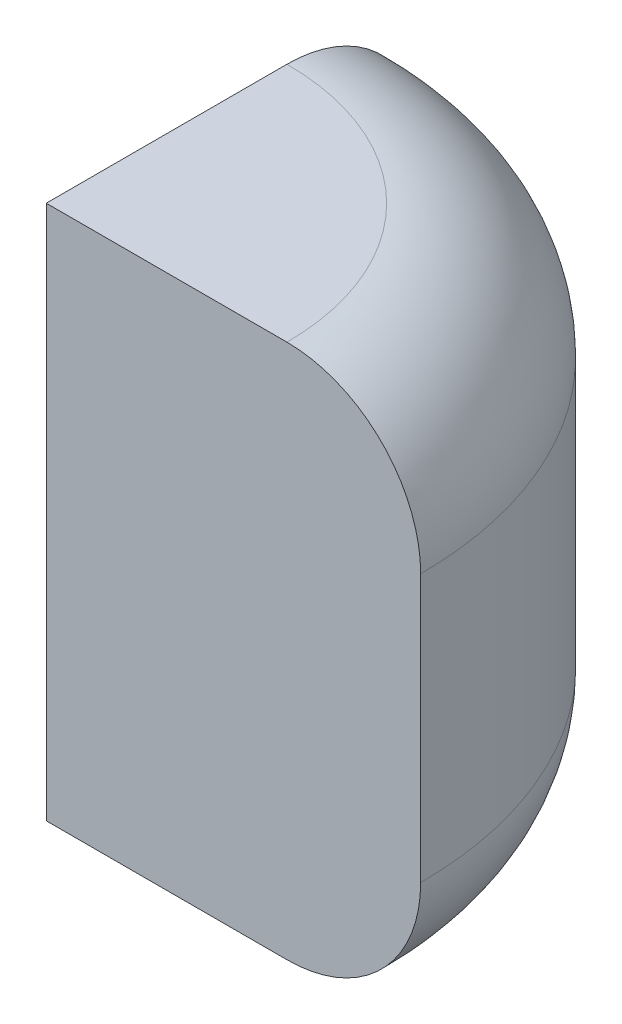
ISO-10303-21;
HEADER;
FILE_DESCRIPTION(('STEP AP214'),'2;1');
FILE_NAME('part.step','',(''),(''),'','','');
FILE_SCHEMA(('AUTOMOTIVE_DESIGN { 1 0 10303 214 1 1 1 1 }'));
ENDSEC;
DATA;
#1=APPLICATION_CONTEXT('core data for automotive mechanical design processes');
#2=APPLICATION_PROTOCOL_DEFINITION('international standard','automotive_design',2000,#1);
#3=PRODUCT_CONTEXT('',#1,'mechanical');
#4=PRODUCT('Part','Part','',(#3));
#5=PRODUCT_RELATED_PRODUCT_CATEGORY('part','',(#4));
#6=PRODUCT_DEFINITION_FORMATION('','',#4);
#7=PRODUCT_DEFINITION_CONTEXT('part definition',#1,'design');
#8=PRODUCT_DEFINITION('design','',#6,#7);
#9=PRODUCT_DEFINITION_SHAPE('','',#8);
#10=(LENGTH_UNIT() NAMED_UNIT(*) SI_UNIT(.MILLI.,.METRE.));
#11=(NAMED_UNIT(*) PLANE_ANGLE_UNIT() SI_UNIT($,.RADIAN.));
#12=(NAMED_UNIT(*) SI_UNIT($,.STERADIAN.) SOLID_ANGLE_UNIT());
#13=UNCERTAINTY_MEASURE_WITH_UNIT(LENGTH_MEASURE(1.E-05),#10,'distance_accuracy_value','');
#14=(GEOMETRIC_REPRESENTATION_CONTEXT(3) GLOBAL_UNCERTAINTY_ASSIGNED_CONTEXT((#13)) GLOBAL_UNIT_ASSIGNED_CONTEXT((#10,
#11,#12)) REPRESENTATION_CONTEXT('',''));
#15=CARTESIAN_POINT('',(0.,0.,0.));
#16=DIRECTION('',(0.,0.,1.));
#17=DIRECTION('',(1.,0.,0.));
#18=AXIS2_PLACEMENT_3D('',#15,#16,#17);
#19=CARTESIAN_POINT('',(0.,31.75,0.));
#20=DIRECTION('',(0.,-1.,0.));
#21=DIRECTION('',(0.,0.,-1.));
#22=AXIS2_PLACEMENT_3D('',#19,#20,#21);
#23=TOROIDAL_SURFACE('',#22,57.15,31.75);
#24=CARTESIAN_POINT('',(0.,31.7500000000002,0.));
#25=DIRECTION('',(0.,-1.,0.));
#26=DIRECTION('',(0.,0.,-1.));
#27=AXIS2_PLACEMENT_3D('',#24,#25,#26);
#28=CIRCLE('',#27,88.9);
#29=CARTESIAN_POINT('',(-3.10392691023155E-13,31.7500000000002,-88.9));
#30=VERTEX_POINT('',#29);
#31=CARTESIAN_POINT('',(88.9,31.7500000000002,0.));
#32=VERTEX_POINT('',#31);
#33=EDGE_CURVE('E11',#30,#32,#28,.T.);
#34=ORIENTED_EDGE('',*,*,#33,.T.);
#35=CARTESIAN_POINT('',(57.15,31.75,0.));
#36=DIRECTION('',(0.,0.,1.));
#37=DIRECTION('',(1.,0.,0.));
#38=AXIS2_PLACEMENT_3D('',#35,#36,#37);
#39=CIRCLE('',#38,31.75);
#40=CARTESIAN_POINT('',(57.1499999999998,0.,0.));
#41=VERTEX_POINT('',#40);
#42=EDGE_CURVE('E93',#41,#32,#39,.T.);
#43=ORIENTED_EDGE('',*,*,#42,.F.);
#44=CARTESIAN_POINT('',(0.,0.,0.));
#45=DIRECTION('',(0.,-1.,0.));
#46=DIRECTION('',(0.,0.,-1.));
#47=AXIS2_PLACEMENT_3D('',#44,#45,#46);
#48=CIRCLE('',#47,57.1499999999998);
#49=CARTESIAN_POINT('',(-1.99538158514884E-13,0.,-57.1499999999998));
#50=VERTEX_POINT('',#49);
#51=EDGE_CURVE('E59',#50,#41,#48,.T.);
#52=ORIENTED_EDGE('',*,*,#51,.F.);
#53=CARTESIAN_POINT('',(-1.99538158514885E-13,31.75,-57.15));
#54=DIRECTION('',(1.,0.,0.));
#55=DIRECTION('',(0.,0.,-1.));
#56=AXIS2_PLACEMENT_3D('',#53,#54,#55);
#57=CIRCLE('',#56,31.75);
#58=EDGE_CURVE('E94',#50,#30,#57,.T.);
#59=ORIENTED_EDGE('',*,*,#58,.T.);
#60=EDGE_LOOP('',(#34,#43,#52,#59));
#61=FACE_BOUND('',#60,.T.);
#62=ADVANCED_FACE('F43',(#61),#23,.T.);
#63=CARTESIAN_POINT('',(0.,0.,0.));
#64=DIRECTION('',(0.,-1.,0.));
#65=DIRECTION('',(0.,0.,-1.));
#66=AXIS2_PLACEMENT_3D('',#63,#64,#65);
#67=CYLINDRICAL_SURFACE('',#66,88.9);
#68=CARTESIAN_POINT('',(0.,95.2499999999998,0.));
#69=DIRECTION('',(0.,-1.,0.));
#70=DIRECTION('',(0.,0.,-1.));
#71=AXIS2_PLACEMENT_3D('',#68,#69,#70);
#72=CIRCLE('',#71,88.9);
#73=CARTESIAN_POINT('',(-3.10392691023155E-13,95.2499999999998,-88.9));
#74=VERTEX_POINT('',#73);
#75=CARTESIAN_POINT('',(88.9,95.2499999999998,0.));
#76=VERTEX_POINT('',#75);
#77=EDGE_CURVE('E52',#74,#76,#72,.T.);
#78=ORIENTED_EDGE('',*,*,#77,.T.);
#79=DIRECTION('',(0.,1.,0.));
#80=VECTOR('',#79,1.);
#81=CARTESIAN_POINT('',(88.9,31.7500000000002,0.));
#82=LINE('',#81,#80);
#83=EDGE_CURVE('E103',#32,#76,#82,.T.);
#84=ORIENTED_EDGE('',*,*,#83,.F.);
#85=ORIENTED_EDGE('',*,*,#33,.F.);
#86=DIRECTION('',(0.,1.,0.));
#87=VECTOR('',#86,1.);
#88=CARTESIAN_POINT('',(-3.10392691023155E-13,31.7500000000002,-88.9));
#89=LINE('',#88,#87);
#90=EDGE_CURVE('E119',#30,#74,#89,.T.);
#91=ORIENTED_EDGE('',*,*,#90,.T.);
#92=EDGE_LOOP('',(#78,#84,#85,#91));
#93=FACE_BOUND('',#92,.T.);
#94=ADVANCED_FACE('F45',(#93),#67,.T.);
#95=CARTESIAN_POINT('',(0.,95.25,0.));
#96=DIRECTION('',(0.,-1.,0.));
#97=DIRECTION('',(0.,0.,-1.));
#98=AXIS2_PLACEMENT_3D('',#95,#96,#97);
#99=TOROIDAL_SURFACE('',#98,57.15,31.75);
#100=CARTESIAN_POINT('',(0.,127.,0.));
#101=DIRECTION('',(0.,-1.,0.));
#102=DIRECTION('',(0.,0.,-1.));
#103=AXIS2_PLACEMENT_3D('',#100,#101,#102);
#104=CIRCLE('',#103,57.1499999999998);
#105=CARTESIAN_POINT('',(-1.99538158514884E-13,127.,-57.1499999999998));
#106=VERTEX_POINT('',#105);
#107=CARTESIAN_POINT('',(57.1499999999998,127.,0.));
#108=VERTEX_POINT('',#107);
#109=EDGE_CURVE('E133',#106,#108,#104,.T.);
#110=ORIENTED_EDGE('',*,*,#109,.T.);
#111=CARTESIAN_POINT('',(57.15,95.25,0.));
#112=DIRECTION('',(0.,0.,1.));
#113=DIRECTION('',(-1.,0.,0.));
#114=AXIS2_PLACEMENT_3D('',#111,#112,#113);
#115=CIRCLE('',#114,31.75);
#116=EDGE_CURVE('E108',#76,#108,#115,.T.);
#117=ORIENTED_EDGE('',*,*,#116,.F.);
#118=ORIENTED_EDGE('',*,*,#77,.F.);
#119=CARTESIAN_POINT('',(-1.99538158514885E-13,95.25,-57.15));
#120=DIRECTION('',(1.,0.,0.));
#121=DIRECTION('',(0.,0.,1.));
#122=AXIS2_PLACEMENT_3D('',#119,#120,#121);
#123=CIRCLE('',#122,31.75);
#124=EDGE_CURVE('E121',#74,#106,#123,.T.);
#125=ORIENTED_EDGE('',*,*,#124,.T.);
#126=EDGE_LOOP('',(#110,#117,#118,#125));
#127=FACE_BOUND('',#126,.T.);
#128=ADVANCED_FACE('F136',(#127),#99,.T.);
#129=CARTESIAN_POINT('',(0.,127.,0.));
#130=DIRECTION('',(0.,1.,0.));
#131=DIRECTION('',(0.,0.,1.));
#132=AXIS2_PLACEMENT_3D('',#129,#130,#131);
#133=PLANE('',#132);
#134=DIRECTION('',(-1.,0.,0.));
#135=VECTOR('',#134,1.);
#136=CARTESIAN_POINT('',(0.,127.,0.));
#137=LINE('',#136,#135);
#138=CARTESIAN_POINT('',(0.,127.,0.));
#139=VERTEX_POINT('',#138);
#140=EDGE_CURVE('E111',#108,#139,#137,.T.);
#141=ORIENTED_EDGE('',*,*,#140,.F.);
#142=ORIENTED_EDGE('',*,*,#109,.F.);
#143=DIRECTION('',(0.,0.,1.));
#144=VECTOR('',#143,1.);
#145=CARTESIAN_POINT('',(0.,127.,0.));
#146=LINE('',#145,#144);
#147=EDGE_CURVE('E124',#106,#139,#146,.T.);
#148=ORIENTED_EDGE('',*,*,#147,.T.);
#149=EDGE_LOOP('',(#141,#142,#148));
#150=FACE_BOUND('',#149,.T.);
#151=ADVANCED_FACE('F141',(#150),#133,.T.);
#152=CARTESIAN_POINT('',(0.,0.,0.));
#153=DIRECTION('',(0.,-1.,0.));
#154=DIRECTION('',(0.,0.,-1.));
#155=AXIS2_PLACEMENT_3D('',#152,#153,#154);
#156=PLANE('',#155);
#157=DIRECTION('',(0.,0.,-1.));
#158=VECTOR('',#157,1.);
#159=CARTESIAN_POINT('',(0.,0.,0.));
#160=LINE('',#159,#158);
#161=CARTESIAN_POINT('',(0.,0.,0.));
#162=VERTEX_POINT('',#161);
#163=EDGE_CURVE('E129',#162,#50,#160,.T.);
#164=ORIENTED_EDGE('',*,*,#163,.T.);
#165=ORIENTED_EDGE('',*,*,#51,.T.);
#166=DIRECTION('',(1.,0.,0.));
#167=VECTOR('',#166,1.);
#168=CARTESIAN_POINT('',(0.,0.,0.));
#169=LINE('',#168,#167);
#170=EDGE_CURVE('E66',#162,#41,#169,.T.);
#171=ORIENTED_EDGE('',*,*,#170,.F.);
#172=EDGE_LOOP('',(#164,#165,#171));
#173=FACE_BOUND('',#172,.T.);
#174=ADVANCED_FACE('F145',(#173),#156,.T.);
#175=CARTESIAN_POINT('',(-1.99538158514885E-13,31.75,-57.15));
#176=DIRECTION('',(1.,0.,0.));
#177=DIRECTION('',(0.,0.,-1.));
#178=AXIS2_PLACEMENT_3D('',#175,#176,#177);
#179=PLANE('',#178);
#180=ORIENTED_EDGE('',*,*,#58,.F.);
#181=ORIENTED_EDGE('',*,*,#163,.F.);
#182=DIRECTION('',(0.,-1.,0.));
#183=VECTOR('',#182,1.);
#184=CARTESIAN_POINT('',(0.,0.,0.));
#185=LINE('',#184,#183);
#186=EDGE_CURVE('E127',#139,#162,#185,.T.);
#187=ORIENTED_EDGE('',*,*,#186,.F.);
#188=ORIENTED_EDGE('',*,*,#147,.F.);
#189=ORIENTED_EDGE('',*,*,#124,.F.);
#190=ORIENTED_EDGE('',*,*,#90,.F.);
#191=EDGE_LOOP('',(#180,#181,#187,#188,#189,#190));
#192=FACE_BOUND('',#191,.T.);
#193=ADVANCED_FACE('F143',(#192),#179,.F.);
#194=CARTESIAN_POINT('',(57.15,31.75,0.));
#195=DIRECTION('',(0.,0.,1.));
#196=DIRECTION('',(1.,0.,0.));
#197=AXIS2_PLACEMENT_3D('',#194,#195,#196);
#198=PLANE('',#197);
#199=ORIENTED_EDGE('',*,*,#42,.T.);
#200=ORIENTED_EDGE('',*,*,#83,.T.);
#201=ORIENTED_EDGE('',*,*,#116,.T.);
#202=ORIENTED_EDGE('',*,*,#140,.T.);
#203=ORIENTED_EDGE('',*,*,#186,.T.);
#204=ORIENTED_EDGE('',*,*,#170,.T.);
#205=EDGE_LOOP('',(#199,#200,#201,#202,#203,#204));
#206=FACE_BOUND('',#205,.T.);
#207=ADVANCED_FACE('F101',(#206),#198,.T.);
#208=CLOSED_SHELL('',(#62,#94,#128,#151,#174,#193,#207));
#209=MANIFOLD_SOLID_BREP('B2',#208);
#210=ADVANCED_BREP_SHAPE_REPRESENTATION('',(#18,#209),#14);
#211=SHAPE_DEFINITION_REPRESENTATION(#9,#210);
ENDSEC;
END-ISO-10303-21;
